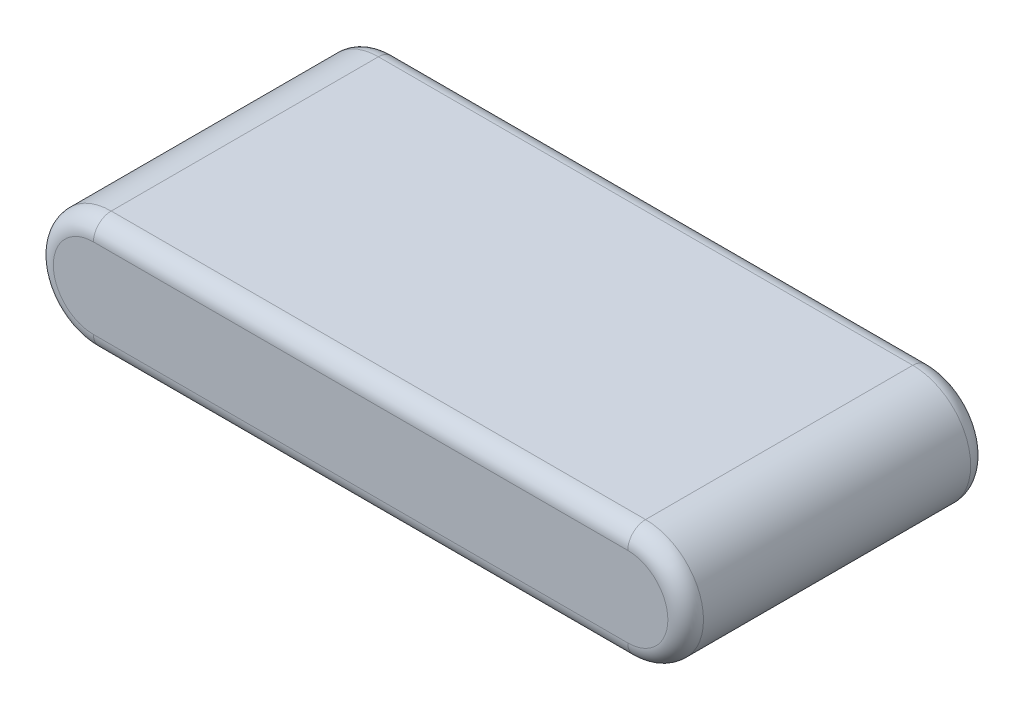
ISO-10303-21;
HEADER;
FILE_DESCRIPTION(('STEP AP214'),'2;1');
FILE_NAME('part.step','',(''),(''),'','','');
FILE_SCHEMA(('AUTOMOTIVE_DESIGN { 1 0 10303 214 1 1 1 1 }'));
ENDSEC;
DATA;
#1=APPLICATION_CONTEXT('core data for automotive mechanical design processes');
#2=APPLICATION_PROTOCOL_DEFINITION('international standard','automotive_design',2000,#1);
#3=PRODUCT_CONTEXT('',#1,'mechanical');
#4=PRODUCT('Part','Part','',(#3));
#5=PRODUCT_RELATED_PRODUCT_CATEGORY('part','',(#4));
#6=PRODUCT_DEFINITION_FORMATION('','',#4);
#7=PRODUCT_DEFINITION_CONTEXT('part definition',#1,'design');
#8=PRODUCT_DEFINITION('design','',#6,#7);
#9=PRODUCT_DEFINITION_SHAPE('','',#8);
#10=(LENGTH_UNIT() NAMED_UNIT(*) SI_UNIT(.MILLI.,.METRE.));
#11=(NAMED_UNIT(*) PLANE_ANGLE_UNIT() SI_UNIT($,.RADIAN.));
#12=(NAMED_UNIT(*) SI_UNIT($,.STERADIAN.) SOLID_ANGLE_UNIT());
#13=UNCERTAINTY_MEASURE_WITH_UNIT(LENGTH_MEASURE(1.E-05),#10,'distance_accuracy_value','');
#14=(GEOMETRIC_REPRESENTATION_CONTEXT(3) GLOBAL_UNCERTAINTY_ASSIGNED_CONTEXT((#13)) GLOBAL_UNIT_ASSIGNED_CONTEXT((#10,
#11,#12)) REPRESENTATION_CONTEXT('',''));
#15=CARTESIAN_POINT('',(0.,0.,0.));
#16=DIRECTION('',(0.,0.,1.));
#17=DIRECTION('',(1.,0.,0.));
#18=AXIS2_PLACEMENT_3D('',#15,#16,#17);
#19=CARTESIAN_POINT('',(0.,0.,17.));
#20=DIRECTION('',(0.,0.,-1.));
#21=DIRECTION('',(-1.,0.,0.));
#22=AXIS2_PLACEMENT_3D('',#19,#20,#21);
#23=CYLINDRICAL_SURFACE('',#22,3.25);
#24=DIRECTION('',(0.,0.,-1.));
#25=VECTOR('',#24,1.);
#26=CARTESIAN_POINT('',(0.,3.25,17.));
#27=LINE('',#26,#25);
#28=CARTESIAN_POINT('',(0.,3.25,16.));
#29=VERTEX_POINT('',#28);
#30=CARTESIAN_POINT('',(0.,3.25,1.));
#31=VERTEX_POINT('',#30);
#32=EDGE_CURVE('E141',#29,#31,#27,.T.);
#33=ORIENTED_EDGE('',*,*,#32,.T.);
#34=CARTESIAN_POINT('',(0.,0.,1.));
#35=DIRECTION('',(0.,0.,1.));
#36=DIRECTION('',(1.,0.,0.));
#37=AXIS2_PLACEMENT_3D('',#34,#35,#36);
#38=CIRCLE('',#37,3.25);
#39=CARTESIAN_POINT('',(0.,-3.25,1.));
#40=VERTEX_POINT('',#39);
#41=EDGE_CURVE('E150',#31,#40,#38,.T.);
#42=ORIENTED_EDGE('',*,*,#41,.T.);
#43=DIRECTION('',(0.,0.,-1.));
#44=VECTOR('',#43,1.);
#45=CARTESIAN_POINT('',(0.,-3.25,17.));
#46=LINE('',#45,#44);
#47=CARTESIAN_POINT('',(0.,-3.25,16.));
#48=VERTEX_POINT('',#47);
#49=EDGE_CURVE('E119',#48,#40,#46,.T.);
#50=ORIENTED_EDGE('',*,*,#49,.F.);
#51=CARTESIAN_POINT('',(0.,0.,16.));
#52=DIRECTION('',(0.,0.,1.));
#53=DIRECTION('',(1.,0.,0.));
#54=AXIS2_PLACEMENT_3D('',#51,#52,#53);
#55=CIRCLE('',#54,3.25);
#56=EDGE_CURVE('E152',#48,#29,#55,.F.);
#57=ORIENTED_EDGE('',*,*,#56,.T.);
#58=EDGE_LOOP('',(#33,#42,#50,#57));
#59=FACE_BOUND('',#58,.T.);
#60=ADVANCED_FACE('F32',(#59),#23,.T.);
#61=CARTESIAN_POINT('',(0.,-3.25,17.));
#62=DIRECTION('',(0.,1.,0.));
#63=DIRECTION('',(0.,0.,1.));
#64=AXIS2_PLACEMENT_3D('',#61,#62,#63);
#65=PLANE('',#64);
#66=ORIENTED_EDGE('',*,*,#49,.T.);
#67=DIRECTION('',(1.,0.,0.));
#68=VECTOR('',#67,1.);
#69=CARTESIAN_POINT('',(0.,-3.25,1.));
#70=LINE('',#69,#68);
#71=CARTESIAN_POINT('',(30.,-3.25,1.));
#72=VERTEX_POINT('',#71);
#73=EDGE_CURVE('E118',#40,#72,#70,.T.);
#74=ORIENTED_EDGE('',*,*,#73,.T.);
#75=DIRECTION('',(0.,0.,-1.));
#76=VECTOR('',#75,1.);
#77=CARTESIAN_POINT('',(30.,-3.25,17.));
#78=LINE('',#77,#76);
#79=CARTESIAN_POINT('',(30.,-3.25,16.));
#80=VERTEX_POINT('',#79);
#81=EDGE_CURVE('E101',#80,#72,#78,.T.);
#82=ORIENTED_EDGE('',*,*,#81,.F.);
#83=DIRECTION('',(1.,0.,0.));
#84=VECTOR('',#83,1.);
#85=CARTESIAN_POINT('',(0.,-3.25,16.));
#86=LINE('',#85,#84);
#87=EDGE_CURVE('E115',#80,#48,#86,.F.);
#88=ORIENTED_EDGE('',*,*,#87,.T.);
#89=EDGE_LOOP('',(#66,#74,#82,#88));
#90=FACE_BOUND('',#89,.T.);
#91=ADVANCED_FACE('F114',(#90),#65,.F.);
#92=CARTESIAN_POINT('',(30.,0.,17.));
#93=DIRECTION('',(0.,0.,-1.));
#94=DIRECTION('',(-1.,0.,0.));
#95=AXIS2_PLACEMENT_3D('',#92,#93,#94);
#96=CYLINDRICAL_SURFACE('',#95,3.25);
#97=ORIENTED_EDGE('',*,*,#81,.T.);
#98=CARTESIAN_POINT('',(30.,0.,1.));
#99=DIRECTION('',(0.,0.,1.));
#100=DIRECTION('',(1.,0.,0.));
#101=AXIS2_PLACEMENT_3D('',#98,#99,#100);
#102=CIRCLE('',#101,3.25);
#103=CARTESIAN_POINT('',(30.,3.25,1.));
#104=VERTEX_POINT('',#103);
#105=EDGE_CURVE('E107',#72,#104,#102,.T.);
#106=ORIENTED_EDGE('',*,*,#105,.T.);
#107=DIRECTION('',(0.,0.,-1.));
#108=VECTOR('',#107,1.);
#109=CARTESIAN_POINT('',(30.,3.25,17.));
#110=LINE('',#109,#108);
#111=CARTESIAN_POINT('',(30.,3.25,16.));
#112=VERTEX_POINT('',#111);
#113=EDGE_CURVE('E103',#112,#104,#110,.T.);
#114=ORIENTED_EDGE('',*,*,#113,.F.);
#115=CARTESIAN_POINT('',(30.,0.,16.));
#116=DIRECTION('',(0.,0.,1.));
#117=DIRECTION('',(1.,0.,0.));
#118=AXIS2_PLACEMENT_3D('',#115,#116,#117);
#119=CIRCLE('',#118,3.25);
#120=EDGE_CURVE('E98',#112,#80,#119,.F.);
#121=ORIENTED_EDGE('',*,*,#120,.T.);
#122=EDGE_LOOP('',(#97,#106,#114,#121));
#123=FACE_BOUND('',#122,.T.);
#124=ADVANCED_FACE('F100',(#123),#96,.T.);
#125=CARTESIAN_POINT('',(0.,3.25,17.));
#126=DIRECTION('',(0.,-1.,0.));
#127=DIRECTION('',(0.,0.,-1.));
#128=AXIS2_PLACEMENT_3D('',#125,#126,#127);
#129=PLANE('',#128);
#130=ORIENTED_EDGE('',*,*,#113,.T.);
#131=DIRECTION('',(-1.,0.,0.));
#132=VECTOR('',#131,1.);
#133=CARTESIAN_POINT('',(0.,3.25,1.));
#134=LINE('',#133,#132);
#135=EDGE_CURVE('E154',#104,#31,#134,.T.);
#136=ORIENTED_EDGE('',*,*,#135,.T.);
#137=ORIENTED_EDGE('',*,*,#32,.F.);
#138=DIRECTION('',(-1.,0.,0.));
#139=VECTOR('',#138,1.);
#140=CARTESIAN_POINT('',(30.,3.25,16.));
#141=LINE('',#140,#139);
#142=EDGE_CURVE('E156',#29,#112,#141,.F.);
#143=ORIENTED_EDGE('',*,*,#142,.T.);
#144=EDGE_LOOP('',(#130,#136,#137,#143));
#145=FACE_BOUND('',#144,.T.);
#146=ADVANCED_FACE('F194',(#145),#129,.F.);
#147=CARTESIAN_POINT('',(0.,0.,17.));
#148=DIRECTION('',(0.,0.,1.));
#149=DIRECTION('',(1.,0.,0.));
#150=AXIS2_PLACEMENT_3D('',#147,#148,#149);
#151=PLANE('',#150);
#152=CARTESIAN_POINT('',(30.,0.,17.));
#153=DIRECTION('',(0.,0.,1.));
#154=DIRECTION('',(1.,0.,0.));
#155=AXIS2_PLACEMENT_3D('',#152,#153,#154);
#156=CIRCLE('',#155,2.25);
#157=CARTESIAN_POINT('',(30.,-2.25,17.));
#158=VERTEX_POINT('',#157);
#159=CARTESIAN_POINT('',(30.,2.25,17.));
#160=VERTEX_POINT('',#159);
#161=EDGE_CURVE('E41',#158,#160,#156,.T.);
#162=ORIENTED_EDGE('',*,*,#161,.T.);
#163=DIRECTION('',(-1.,0.,0.));
#164=VECTOR('',#163,1.);
#165=CARTESIAN_POINT('',(0.,2.25,17.));
#166=LINE('',#165,#164);
#167=CARTESIAN_POINT('',(0.,2.25,17.));
#168=VERTEX_POINT('',#167);
#169=EDGE_CURVE('E11',#160,#168,#166,.T.);
#170=ORIENTED_EDGE('',*,*,#169,.T.);
#171=CARTESIAN_POINT('',(0.,0.,17.));
#172=DIRECTION('',(0.,0.,1.));
#173=DIRECTION('',(1.,0.,0.));
#174=AXIS2_PLACEMENT_3D('',#171,#172,#173);
#175=CIRCLE('',#174,2.25);
#176=CARTESIAN_POINT('',(0.,-2.25,17.));
#177=VERTEX_POINT('',#176);
#178=EDGE_CURVE('E148',#168,#177,#175,.T.);
#179=ORIENTED_EDGE('',*,*,#178,.T.);
#180=DIRECTION('',(1.,0.,0.));
#181=VECTOR('',#180,1.);
#182=CARTESIAN_POINT('',(30.,-2.25,17.));
#183=LINE('',#182,#181);
#184=EDGE_CURVE('E52',#177,#158,#183,.T.);
#185=ORIENTED_EDGE('',*,*,#184,.T.);
#186=EDGE_LOOP('',(#162,#170,#179,#185));
#187=FACE_BOUND('',#186,.T.);
#188=ADVANCED_FACE('F200',(#187),#151,.T.);
#189=CARTESIAN_POINT('',(0.,0.,0.));
#190=DIRECTION('',(0.,0.,1.));
#191=DIRECTION('',(1.,0.,0.));
#192=AXIS2_PLACEMENT_3D('',#189,#190,#191);
#193=PLANE('',#192);
#194=CARTESIAN_POINT('',(30.,0.,0.));
#195=DIRECTION('',(0.,0.,1.));
#196=DIRECTION('',(1.,0.,0.));
#197=AXIS2_PLACEMENT_3D('',#194,#195,#196);
#198=CIRCLE('',#197,2.25);
#199=CARTESIAN_POINT('',(30.,2.25,0.));
#200=VERTEX_POINT('',#199);
#201=CARTESIAN_POINT('',(30.,-2.25,0.));
#202=VERTEX_POINT('',#201);
#203=EDGE_CURVE('E161',#200,#202,#198,.F.);
#204=ORIENTED_EDGE('',*,*,#203,.T.);
#205=DIRECTION('',(1.,0.,0.));
#206=VECTOR('',#205,1.);
#207=CARTESIAN_POINT('',(0.,-2.25,0.));
#208=LINE('',#207,#206);
#209=CARTESIAN_POINT('',(0.,-2.25,0.));
#210=VERTEX_POINT('',#209);
#211=EDGE_CURVE('E108',#202,#210,#208,.F.);
#212=ORIENTED_EDGE('',*,*,#211,.T.);
#213=CARTESIAN_POINT('',(0.,0.,0.));
#214=DIRECTION('',(0.,0.,1.));
#215=DIRECTION('',(1.,0.,0.));
#216=AXIS2_PLACEMENT_3D('',#213,#214,#215);
#217=CIRCLE('',#216,2.25);
#218=CARTESIAN_POINT('',(0.,2.25,0.));
#219=VERTEX_POINT('',#218);
#220=EDGE_CURVE('E165',#210,#219,#217,.F.);
#221=ORIENTED_EDGE('',*,*,#220,.T.);
#222=DIRECTION('',(-1.,0.,0.));
#223=VECTOR('',#222,1.);
#224=CARTESIAN_POINT('',(0.,2.25,0.));
#225=LINE('',#224,#223);
#226=EDGE_CURVE('E163',#219,#200,#225,.F.);
#227=ORIENTED_EDGE('',*,*,#226,.T.);
#228=EDGE_LOOP('',(#204,#212,#221,#227));
#229=FACE_BOUND('',#228,.T.);
#230=ADVANCED_FACE('F202',(#229),#193,.F.);
#231=CARTESIAN_POINT('',(0.,2.25,1.));
#232=DIRECTION('',(-1.,0.,0.));
#233=DIRECTION('',(0.,0.,1.));
#234=AXIS2_PLACEMENT_3D('',#231,#232,#233);
#235=CYLINDRICAL_SURFACE('',#234,1.);
#236=CARTESIAN_POINT('',(30.,2.25,1.));
#237=DIRECTION('',(1.,0.,0.));
#238=DIRECTION('',(0.,0.,-1.));
#239=AXIS2_PLACEMENT_3D('',#236,#237,#238);
#240=CIRCLE('',#239,1.);
#241=EDGE_CURVE('E142',#200,#104,#240,.T.);
#242=ORIENTED_EDGE('',*,*,#241,.F.);
#243=ORIENTED_EDGE('',*,*,#226,.F.);
#244=CARTESIAN_POINT('',(0.,2.25,1.));
#245=DIRECTION('',(-1.,0.,0.));
#246=DIRECTION('',(0.,0.,1.));
#247=AXIS2_PLACEMENT_3D('',#244,#245,#246);
#248=CIRCLE('',#247,1.);
#249=EDGE_CURVE('E138',#31,#219,#248,.T.);
#250=ORIENTED_EDGE('',*,*,#249,.F.);
#251=ORIENTED_EDGE('',*,*,#135,.F.);
#252=EDGE_LOOP('',(#242,#243,#250,#251));
#253=FACE_BOUND('',#252,.T.);
#254=ADVANCED_FACE('F181',(#253),#235,.T.);
#255=CARTESIAN_POINT('',(0.,0.,1.));
#256=DIRECTION('',(0.,0.,1.));
#257=DIRECTION('',(1.,0.,0.));
#258=AXIS2_PLACEMENT_3D('',#255,#256,#257);
#259=TOROIDAL_SURFACE('',#258,2.25,1.);
#260=ORIENTED_EDGE('',*,*,#249,.T.);
#261=ORIENTED_EDGE('',*,*,#220,.F.);
#262=CARTESIAN_POINT('',(0.,-2.25,1.));
#263=DIRECTION('',(1.,0.,0.));
#264=DIRECTION('',(0.,0.,-1.));
#265=AXIS2_PLACEMENT_3D('',#262,#263,#264);
#266=CIRCLE('',#265,1.);
#267=EDGE_CURVE('E129',#40,#210,#266,.T.);
#268=ORIENTED_EDGE('',*,*,#267,.F.);
#269=ORIENTED_EDGE('',*,*,#41,.F.);
#270=EDGE_LOOP('',(#260,#261,#268,#269));
#271=FACE_BOUND('',#270,.T.);
#272=ADVANCED_FACE('F185',(#271),#259,.T.);
#273=CARTESIAN_POINT('',(30.,0.,1.));
#274=DIRECTION('',(0.,0.,1.));
#275=DIRECTION('',(1.,0.,0.));
#276=AXIS2_PLACEMENT_3D('',#273,#274,#275);
#277=TOROIDAL_SURFACE('',#276,2.25,1.);
#278=ORIENTED_EDGE('',*,*,#241,.T.);
#279=ORIENTED_EDGE('',*,*,#105,.F.);
#280=CARTESIAN_POINT('',(30.,-2.25,1.));
#281=DIRECTION('',(-1.,0.,0.));
#282=DIRECTION('',(0.,0.,1.));
#283=AXIS2_PLACEMENT_3D('',#280,#281,#282);
#284=CIRCLE('',#283,1.);
#285=EDGE_CURVE('E128',#202,#72,#284,.T.);
#286=ORIENTED_EDGE('',*,*,#285,.F.);
#287=ORIENTED_EDGE('',*,*,#203,.F.);
#288=EDGE_LOOP('',(#278,#279,#286,#287));
#289=FACE_BOUND('',#288,.T.);
#290=ADVANCED_FACE('F193',(#289),#277,.T.);
#291=CARTESIAN_POINT('',(0.,-2.25,1.));
#292=DIRECTION('',(1.,0.,0.));
#293=DIRECTION('',(0.,0.,-1.));
#294=AXIS2_PLACEMENT_3D('',#291,#292,#293);
#295=CYLINDRICAL_SURFACE('',#294,1.);
#296=ORIENTED_EDGE('',*,*,#267,.T.);
#297=ORIENTED_EDGE('',*,*,#211,.F.);
#298=ORIENTED_EDGE('',*,*,#285,.T.);
#299=ORIENTED_EDGE('',*,*,#73,.F.);
#300=EDGE_LOOP('',(#296,#297,#298,#299));
#301=FACE_BOUND('',#300,.T.);
#302=ADVANCED_FACE('F188',(#301),#295,.T.);
#303=CARTESIAN_POINT('',(0.,-2.25,16.));
#304=DIRECTION('',(-1.,0.,0.));
#305=DIRECTION('',(0.,0.,1.));
#306=AXIS2_PLACEMENT_3D('',#303,#304,#305);
#307=CYLINDRICAL_SURFACE('',#306,1.);
#308=CARTESIAN_POINT('',(0.,-2.25,16.));
#309=DIRECTION('',(-1.,0.,0.));
#310=DIRECTION('',(0.,0.,1.));
#311=AXIS2_PLACEMENT_3D('',#308,#309,#310);
#312=CIRCLE('',#311,1.);
#313=EDGE_CURVE('E124',#48,#177,#312,.T.);
#314=ORIENTED_EDGE('',*,*,#313,.F.);
#315=ORIENTED_EDGE('',*,*,#87,.F.);
#316=CARTESIAN_POINT('',(30.,-2.25,16.));
#317=DIRECTION('',(1.,0.,0.));
#318=DIRECTION('',(0.,0.,-1.));
#319=AXIS2_PLACEMENT_3D('',#316,#317,#318);
#320=CIRCLE('',#319,1.);
#321=EDGE_CURVE('E36',#158,#80,#320,.T.);
#322=ORIENTED_EDGE('',*,*,#321,.F.);
#323=ORIENTED_EDGE('',*,*,#184,.F.);
#324=EDGE_LOOP('',(#314,#315,#322,#323));
#325=FACE_BOUND('',#324,.T.);
#326=ADVANCED_FACE('F34',(#325),#307,.T.);
#327=CARTESIAN_POINT('',(30.,0.,16.));
#328=DIRECTION('',(0.,0.,1.));
#329=DIRECTION('',(1.,0.,0.));
#330=AXIS2_PLACEMENT_3D('',#327,#328,#329);
#331=TOROIDAL_SURFACE('',#330,2.25,1.);
#332=ORIENTED_EDGE('',*,*,#321,.T.);
#333=ORIENTED_EDGE('',*,*,#120,.F.);
#334=CARTESIAN_POINT('',(30.,2.25,16.));
#335=DIRECTION('',(-1.,0.,0.));
#336=DIRECTION('',(0.,0.,1.));
#337=AXIS2_PLACEMENT_3D('',#334,#335,#336);
#338=CIRCLE('',#337,1.);
#339=EDGE_CURVE('E131',#160,#112,#338,.T.);
#340=ORIENTED_EDGE('',*,*,#339,.F.);
#341=ORIENTED_EDGE('',*,*,#161,.F.);
#342=EDGE_LOOP('',(#332,#333,#340,#341));
#343=FACE_BOUND('',#342,.T.);
#344=ADVANCED_FACE('F127',(#343),#331,.T.);
#345=CARTESIAN_POINT('',(0.,0.,16.));
#346=DIRECTION('',(0.,0.,1.));
#347=DIRECTION('',(1.,0.,0.));
#348=AXIS2_PLACEMENT_3D('',#345,#346,#347);
#349=TOROIDAL_SURFACE('',#348,2.25,1.);
#350=ORIENTED_EDGE('',*,*,#313,.T.);
#351=ORIENTED_EDGE('',*,*,#178,.F.);
#352=CARTESIAN_POINT('',(0.,2.25,16.));
#353=DIRECTION('',(1.,0.,0.));
#354=DIRECTION('',(0.,0.,-1.));
#355=AXIS2_PLACEMENT_3D('',#352,#353,#354);
#356=CIRCLE('',#355,1.);
#357=EDGE_CURVE('E134',#29,#168,#356,.T.);
#358=ORIENTED_EDGE('',*,*,#357,.F.);
#359=ORIENTED_EDGE('',*,*,#56,.F.);
#360=EDGE_LOOP('',(#350,#351,#358,#359));
#361=FACE_BOUND('',#360,.T.);
#362=ADVANCED_FACE('F199',(#361),#349,.T.);
#363=CARTESIAN_POINT('',(0.,2.25,16.));
#364=DIRECTION('',(1.,0.,0.));
#365=DIRECTION('',(0.,0.,-1.));
#366=AXIS2_PLACEMENT_3D('',#363,#364,#365);
#367=CYLINDRICAL_SURFACE('',#366,1.);
#368=ORIENTED_EDGE('',*,*,#339,.T.);
#369=ORIENTED_EDGE('',*,*,#142,.F.);
#370=ORIENTED_EDGE('',*,*,#357,.T.);
#371=ORIENTED_EDGE('',*,*,#169,.F.);
#372=EDGE_LOOP('',(#368,#369,#370,#371));
#373=FACE_BOUND('',#372,.T.);
#374=ADVANCED_FACE('F197',(#373),#367,.T.);
#375=CLOSED_SHELL('',(#60,#91,#124,#146,#188,#230,#254,#272,#290,#302,#326,#344,#362,#374));
#376=MANIFOLD_SOLID_BREP('B2',#375);
#377=ADVANCED_BREP_SHAPE_REPRESENTATION('',(#18,#376),#14);
#378=SHAPE_DEFINITION_REPRESENTATION(#9,#377);
ENDSEC;
END-ISO-10303-21;
